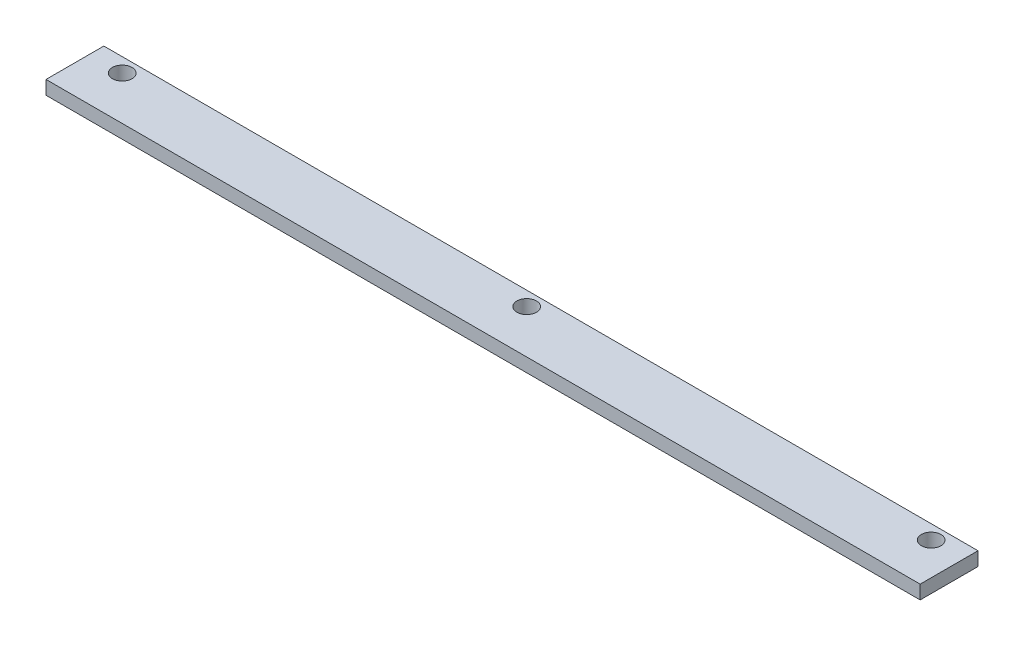
ISO-10303-21;
HEADER;
FILE_DESCRIPTION(('STEP AP214'),'2;1');
FILE_NAME('part.step','',(''),(''),'','','');
FILE_SCHEMA(('AUTOMOTIVE_DESIGN { 1 0 10303 214 1 1 1 1 }'));
ENDSEC;
DATA;
#1=APPLICATION_CONTEXT('core data for automotive mechanical design processes');
#2=APPLICATION_PROTOCOL_DEFINITION('international standard','automotive_design',2000,#1);
#3=PRODUCT_CONTEXT('',#1,'mechanical');
#4=PRODUCT('Part','Part','',(#3));
#5=PRODUCT_RELATED_PRODUCT_CATEGORY('part','',(#4));
#6=PRODUCT_DEFINITION_FORMATION('','',#4);
#7=PRODUCT_DEFINITION_CONTEXT('part definition',#1,'design');
#8=PRODUCT_DEFINITION('design','',#6,#7);
#9=PRODUCT_DEFINITION_SHAPE('','',#8);
#10=(LENGTH_UNIT() NAMED_UNIT(*) SI_UNIT(.MILLI.,.METRE.));
#11=(NAMED_UNIT(*) PLANE_ANGLE_UNIT() SI_UNIT($,.RADIAN.));
#12=(NAMED_UNIT(*) SI_UNIT($,.STERADIAN.) SOLID_ANGLE_UNIT());
#13=UNCERTAINTY_MEASURE_WITH_UNIT(LENGTH_MEASURE(1.E-05),#10,'distance_accuracy_value','');
#14=(GEOMETRIC_REPRESENTATION_CONTEXT(3) GLOBAL_UNCERTAINTY_ASSIGNED_CONTEXT((#13)) GLOBAL_UNIT_ASSIGNED_CONTEXT((#10,
#11,#12)) REPRESENTATION_CONTEXT('',''));
#15=CARTESIAN_POINT('',(0.,0.,0.));
#16=DIRECTION('',(0.,0.,1.));
#17=DIRECTION('',(1.,0.,0.));
#18=AXIS2_PLACEMENT_3D('',#15,#16,#17);
#19=CARTESIAN_POINT('',(-6.75000000000001,0.0990000000000001,2.9));
#20=DIRECTION('',(0.,1.,0.));
#21=DIRECTION('',(0.,0.,1.));
#22=AXIS2_PLACEMENT_3D('',#19,#20,#21);
#23=CYLINDRICAL_SURFACE('',#22,2.);
#24=CARTESIAN_POINT('',(-6.75000000000001,0.1,2.9));
#25=DIRECTION('',(0.,-1.,0.));
#26=DIRECTION('',(0.,0.,-1.));
#27=AXIS2_PLACEMENT_3D('',#24,#25,#26);
#28=CIRCLE('',#27,2.);
#29=CARTESIAN_POINT('',(-6.75000000000001,0.1,0.900000000000003));
#30=VERTEX_POINT('',#29);
#31=EDGE_CURVE('E54',#30,#30,#28,.F.);
#32=ORIENTED_EDGE('',*,*,#31,.F.);
#33=EDGE_LOOP('',(#32));
#34=FACE_BOUND('',#33,.T.);
#35=CARTESIAN_POINT('',(-6.75000000000001,2.9,2.9));
#36=DIRECTION('',(0.,1.,0.));
#37=DIRECTION('',(0.,0.,1.));
#38=AXIS2_PLACEMENT_3D('',#35,#36,#37);
#39=CIRCLE('',#38,2.);
#40=CARTESIAN_POINT('',(-6.75000000000001,2.9,4.9));
#41=VERTEX_POINT('',#40);
#42=EDGE_CURVE('E11',#41,#41,#39,.T.);
#43=ORIENTED_EDGE('',*,*,#42,.T.);
#44=EDGE_LOOP('',(#43));
#45=FACE_BOUND('',#44,.T.);
#46=ADVANCED_FACE('F45',(#34,#45),#23,.F.);
#47=CARTESIAN_POINT('',(-0.1,0.1,11.8));
#48=DIRECTION('',(-1.,0.,0.));
#49=DIRECTION('',(0.,0.,1.));
#50=AXIS2_PLACEMENT_3D('',#47,#48,#49);
#51=PLANE('',#50);
#52=DIRECTION('',(0.,1.,0.));
#53=VECTOR('',#52,1.);
#54=CARTESIAN_POINT('',(-0.1,0.1,0.));
#55=LINE('',#54,#53);
#56=CARTESIAN_POINT('',(-0.1,0.1,0.));
#57=VERTEX_POINT('',#56);
#58=CARTESIAN_POINT('',(-0.1,2.9,0.));
#59=VERTEX_POINT('',#58);
#60=EDGE_CURVE('E118',#57,#59,#55,.T.);
#61=ORIENTED_EDGE('',*,*,#60,.T.);
#62=DIRECTION('',(0.,0.,-1.));
#63=VECTOR('',#62,1.);
#64=CARTESIAN_POINT('',(-0.1,2.9,11.8));
#65=LINE('',#64,#63);
#66=CARTESIAN_POINT('',(-0.1,2.9,11.8));
#67=VERTEX_POINT('',#66);
#68=EDGE_CURVE('E108',#67,#59,#65,.T.);
#69=ORIENTED_EDGE('',*,*,#68,.F.);
#70=DIRECTION('',(0.,1.,0.));
#71=VECTOR('',#70,1.);
#72=CARTESIAN_POINT('',(-0.1,0.1,11.8));
#73=LINE('',#72,#71);
#74=CARTESIAN_POINT('',(-0.1,0.1,11.8));
#75=VERTEX_POINT('',#74);
#76=EDGE_CURVE('E96',#75,#67,#73,.T.);
#77=ORIENTED_EDGE('',*,*,#76,.F.);
#78=DIRECTION('',(0.,0.,-1.));
#79=VECTOR('',#78,1.);
#80=CARTESIAN_POINT('',(-0.1,0.1,11.8));
#81=LINE('',#80,#79);
#82=EDGE_CURVE('E62',#75,#57,#81,.T.);
#83=ORIENTED_EDGE('',*,*,#82,.T.);
#84=EDGE_LOOP('',(#61,#69,#77,#83));
#85=FACE_BOUND('',#84,.T.);
#86=ADVANCED_FACE('F144',(#85),#51,.F.);
#87=CARTESIAN_POINT('',(-0.1,2.9,11.8));
#88=DIRECTION('',(0.,-1.,0.));
#89=DIRECTION('',(0.,0.,-1.));
#90=AXIS2_PLACEMENT_3D('',#87,#88,#89);
#91=PLANE('',#90);
#92=CARTESIAN_POINT('',(-89.25,2.9,2.9));
#93=DIRECTION('',(0.,1.,0.));
#94=DIRECTION('',(0.,0.,1.));
#95=AXIS2_PLACEMENT_3D('',#92,#93,#94);
#96=CIRCLE('',#95,2.);
#97=CARTESIAN_POINT('',(-89.25,2.9,4.9));
#98=VERTEX_POINT('',#97);
#99=EDGE_CURVE('E180',#98,#98,#96,.T.);
#100=ORIENTED_EDGE('',*,*,#99,.F.);
#101=EDGE_LOOP('',(#100));
#102=FACE_BOUND('',#101,.T.);
#103=CARTESIAN_POINT('',(-171.75,2.9,2.9));
#104=DIRECTION('',(0.,1.,0.));
#105=DIRECTION('',(0.,0.,1.));
#106=AXIS2_PLACEMENT_3D('',#103,#104,#105);
#107=CIRCLE('',#106,2.);
#108=CARTESIAN_POINT('',(-171.75,2.9,4.9));
#109=VERTEX_POINT('',#108);
#110=EDGE_CURVE('E121',#109,#109,#107,.T.);
#111=ORIENTED_EDGE('',*,*,#110,.F.);
#112=EDGE_LOOP('',(#111));
#113=FACE_BOUND('',#112,.T.);
#114=DIRECTION('',(-1.,0.,0.));
#115=VECTOR('',#114,1.);
#116=CARTESIAN_POINT('',(-0.1,2.9,0.));
#117=LINE('',#116,#115);
#118=CARTESIAN_POINT('',(-178.4,2.9,0.));
#119=VERTEX_POINT('',#118);
#120=EDGE_CURVE('E104',#59,#119,#117,.T.);
#121=ORIENTED_EDGE('',*,*,#120,.T.);
#122=DIRECTION('',(0.,0.,-1.));
#123=VECTOR('',#122,1.);
#124=CARTESIAN_POINT('',(-178.4,2.9,11.8));
#125=LINE('',#124,#123);
#126=CARTESIAN_POINT('',(-178.4,2.9,11.8));
#127=VERTEX_POINT('',#126);
#128=EDGE_CURVE('E101',#127,#119,#125,.T.);
#129=ORIENTED_EDGE('',*,*,#128,.F.);
#130=DIRECTION('',(-1.,0.,0.));
#131=VECTOR('',#130,1.);
#132=CARTESIAN_POINT('',(-0.1,2.9,11.8));
#133=LINE('',#132,#131);
#134=EDGE_CURVE('E88',#67,#127,#133,.T.);
#135=ORIENTED_EDGE('',*,*,#134,.F.);
#136=ORIENTED_EDGE('',*,*,#68,.T.);
#137=EDGE_LOOP('',(#121,#129,#135,#136));
#138=FACE_BOUND('',#137,.T.);
#139=ORIENTED_EDGE('',*,*,#42,.F.);
#140=EDGE_LOOP('',(#139));
#141=FACE_BOUND('',#140,.T.);
#142=ADVANCED_FACE('F102',(#102,#113,#138,#141),#91,.F.);
#143=CARTESIAN_POINT('',(-178.4,0.1,11.8));
#144=DIRECTION('',(-1.,0.,0.));
#145=DIRECTION('',(0.,0.,1.));
#146=AXIS2_PLACEMENT_3D('',#143,#144,#145);
#147=PLANE('',#146);
#148=DIRECTION('',(0.,1.,0.));
#149=VECTOR('',#148,1.);
#150=CARTESIAN_POINT('',(-178.4,0.1,0.));
#151=LINE('',#150,#149);
#152=CARTESIAN_POINT('',(-178.4,0.1,0.));
#153=VERTEX_POINT('',#152);
#154=EDGE_CURVE('E124',#153,#119,#151,.T.);
#155=ORIENTED_EDGE('',*,*,#154,.F.);
#156=DIRECTION('',(0.,0.,-1.));
#157=VECTOR('',#156,1.);
#158=CARTESIAN_POINT('',(-178.4,0.1,11.8));
#159=LINE('',#158,#157);
#160=CARTESIAN_POINT('',(-178.4,0.1,11.8));
#161=VERTEX_POINT('',#160);
#162=EDGE_CURVE('E76',#161,#153,#159,.T.);
#163=ORIENTED_EDGE('',*,*,#162,.F.);
#164=DIRECTION('',(0.,1.,0.));
#165=VECTOR('',#164,1.);
#166=CARTESIAN_POINT('',(-178.4,0.1,11.8));
#167=LINE('',#166,#165);
#168=EDGE_CURVE('E95',#161,#127,#167,.T.);
#169=ORIENTED_EDGE('',*,*,#168,.T.);
#170=ORIENTED_EDGE('',*,*,#128,.T.);
#171=EDGE_LOOP('',(#155,#163,#169,#170));
#172=FACE_BOUND('',#171,.T.);
#173=ADVANCED_FACE('F110',(#172),#147,.T.);
#174=CARTESIAN_POINT('',(-0.1,0.1,11.8));
#175=DIRECTION('',(0.,-1.,0.));
#176=DIRECTION('',(0.,0.,-1.));
#177=AXIS2_PLACEMENT_3D('',#174,#175,#176);
#178=PLANE('',#177);
#179=CARTESIAN_POINT('',(-89.25,0.1,2.9));
#180=DIRECTION('',(0.,-1.,0.));
#181=DIRECTION('',(0.,0.,-1.));
#182=AXIS2_PLACEMENT_3D('',#179,#180,#181);
#183=CIRCLE('',#182,2.);
#184=CARTESIAN_POINT('',(-89.25,0.1,0.900000000000003));
#185=VERTEX_POINT('',#184);
#186=EDGE_CURVE('E178',#185,#185,#183,.F.);
#187=ORIENTED_EDGE('',*,*,#186,.T.);
#188=EDGE_LOOP('',(#187));
#189=FACE_BOUND('',#188,.T.);
#190=CARTESIAN_POINT('',(-171.75,0.1,2.9));
#191=DIRECTION('',(0.,-1.,0.));
#192=DIRECTION('',(0.,0.,-1.));
#193=AXIS2_PLACEMENT_3D('',#190,#191,#192);
#194=CIRCLE('',#193,2.);
#195=CARTESIAN_POINT('',(-171.75,0.1,0.900000000000003));
#196=VERTEX_POINT('',#195);
#197=EDGE_CURVE('E182',#196,#196,#194,.F.);
#198=ORIENTED_EDGE('',*,*,#197,.T.);
#199=EDGE_LOOP('',(#198));
#200=FACE_BOUND('',#199,.T.);
#201=DIRECTION('',(-1.,0.,0.));
#202=VECTOR('',#201,1.);
#203=CARTESIAN_POINT('',(-0.1,0.1,0.));
#204=LINE('',#203,#202);
#205=EDGE_CURVE('E127',#57,#153,#204,.T.);
#206=ORIENTED_EDGE('',*,*,#205,.F.);
#207=ORIENTED_EDGE('',*,*,#82,.F.);
#208=DIRECTION('',(-1.,0.,0.));
#209=VECTOR('',#208,1.);
#210=CARTESIAN_POINT('',(-0.1,0.1,11.8));
#211=LINE('',#210,#209);
#212=EDGE_CURVE('E112',#75,#161,#211,.T.);
#213=ORIENTED_EDGE('',*,*,#212,.T.);
#214=ORIENTED_EDGE('',*,*,#162,.T.);
#215=EDGE_LOOP('',(#206,#207,#213,#214));
#216=FACE_BOUND('',#215,.T.);
#217=ORIENTED_EDGE('',*,*,#31,.T.);
#218=EDGE_LOOP('',(#217));
#219=FACE_BOUND('',#218,.T.);
#220=ADVANCED_FACE('F140',(#189,#200,#216,#219),#178,.T.);
#221=CARTESIAN_POINT('',(0.,0.,11.8));
#222=DIRECTION('',(0.,0.,1.));
#223=DIRECTION('',(1.,0.,0.));
#224=AXIS2_PLACEMENT_3D('',#221,#222,#223);
#225=PLANE('',#224);
#226=ORIENTED_EDGE('',*,*,#76,.T.);
#227=ORIENTED_EDGE('',*,*,#134,.T.);
#228=ORIENTED_EDGE('',*,*,#168,.F.);
#229=ORIENTED_EDGE('',*,*,#212,.F.);
#230=EDGE_LOOP('',(#226,#227,#228,#229));
#231=FACE_BOUND('',#230,.T.);
#232=ADVANCED_FACE('F92',(#231),#225,.T.);
#233=CARTESIAN_POINT('',(0.,0.,0.));
#234=DIRECTION('',(0.,0.,1.));
#235=DIRECTION('',(1.,0.,0.));
#236=AXIS2_PLACEMENT_3D('',#233,#234,#235);
#237=PLANE('',#236);
#238=ORIENTED_EDGE('',*,*,#60,.F.);
#239=ORIENTED_EDGE('',*,*,#205,.T.);
#240=ORIENTED_EDGE('',*,*,#154,.T.);
#241=ORIENTED_EDGE('',*,*,#120,.F.);
#242=EDGE_LOOP('',(#238,#239,#240,#241));
#243=FACE_BOUND('',#242,.T.);
#244=ADVANCED_FACE('F160',(#243),#237,.F.);
#245=CARTESIAN_POINT('',(-171.75,0.0990000000000001,2.9));
#246=DIRECTION('',(0.,1.,0.));
#247=DIRECTION('',(0.,0.,1.));
#248=AXIS2_PLACEMENT_3D('',#245,#246,#247);
#249=CYLINDRICAL_SURFACE('',#248,2.);
#250=ORIENTED_EDGE('',*,*,#197,.F.);
#251=EDGE_LOOP('',(#250));
#252=FACE_BOUND('',#251,.T.);
#253=ORIENTED_EDGE('',*,*,#110,.T.);
#254=EDGE_LOOP('',(#253));
#255=FACE_BOUND('',#254,.T.);
#256=ADVANCED_FACE('F163',(#252,#255),#249,.F.);
#257=CARTESIAN_POINT('',(-89.25,0.0990000000000001,2.9));
#258=DIRECTION('',(0.,1.,0.));
#259=DIRECTION('',(0.,0.,1.));
#260=AXIS2_PLACEMENT_3D('',#257,#258,#259);
#261=CYLINDRICAL_SURFACE('',#260,2.);
#262=ORIENTED_EDGE('',*,*,#186,.F.);
#263=EDGE_LOOP('',(#262));
#264=FACE_BOUND('',#263,.T.);
#265=ORIENTED_EDGE('',*,*,#99,.T.);
#266=EDGE_LOOP('',(#265));
#267=FACE_BOUND('',#266,.T.);
#268=ADVANCED_FACE('F169',(#264,#267),#261,.F.);
#269=CLOSED_SHELL('',(#46,#86,#142,#173,#220,#232,#244,#256,#268));
#270=MANIFOLD_SOLID_BREP('B2',#269);
#271=ADVANCED_BREP_SHAPE_REPRESENTATION('',(#18,#270),#14);
#272=SHAPE_DEFINITION_REPRESENTATION(#9,#271);
ENDSEC;
END-ISO-10303-21;
